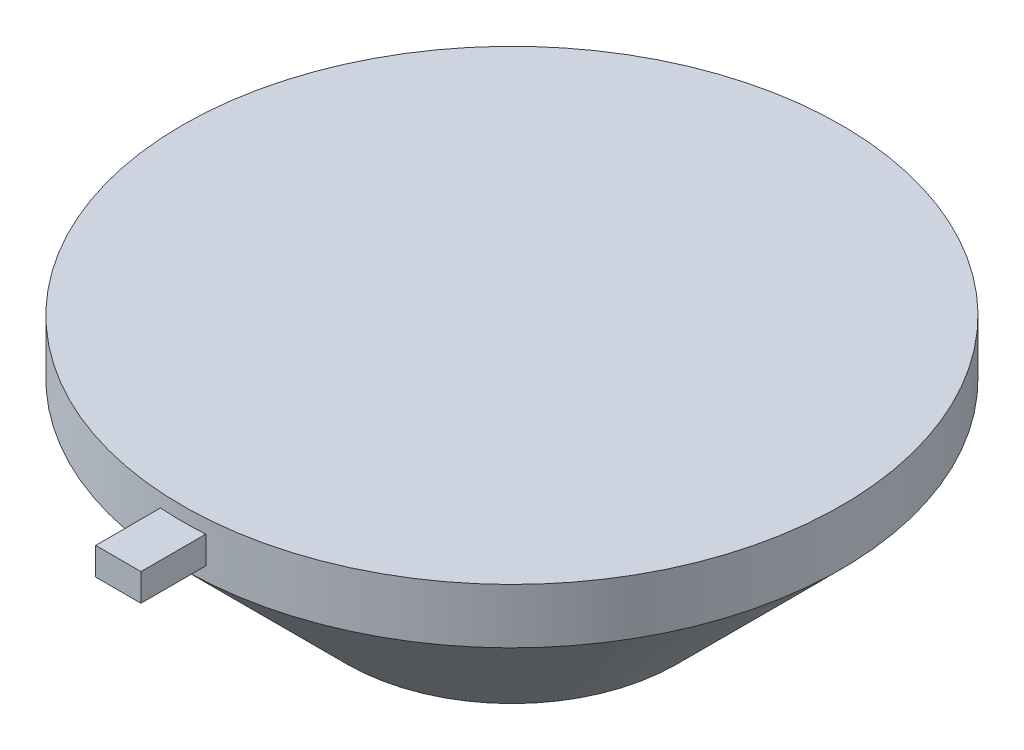
ISO-10303-21;
HEADER;
FILE_DESCRIPTION(('STEP AP214'),'2;1');
FILE_NAME('part.step','',(''),(''),'','','');
FILE_SCHEMA(('AUTOMOTIVE_DESIGN { 1 0 10303 214 1 1 1 1 }'));
ENDSEC;
DATA;
#1=APPLICATION_CONTEXT('core data for automotive mechanical design processes');
#2=APPLICATION_PROTOCOL_DEFINITION('international standard','automotive_design',2000,#1);
#3=PRODUCT_CONTEXT('',#1,'mechanical');
#4=PRODUCT('Part','Part','',(#3));
#5=PRODUCT_RELATED_PRODUCT_CATEGORY('part','',(#4));
#6=PRODUCT_DEFINITION_FORMATION('','',#4);
#7=PRODUCT_DEFINITION_CONTEXT('part definition',#1,'design');
#8=PRODUCT_DEFINITION('design','',#6,#7);
#9=PRODUCT_DEFINITION_SHAPE('','',#8);
#10=(LENGTH_UNIT() NAMED_UNIT(*) SI_UNIT(.MILLI.,.METRE.));
#11=(NAMED_UNIT(*) PLANE_ANGLE_UNIT() SI_UNIT($,.RADIAN.));
#12=(NAMED_UNIT(*) SI_UNIT($,.STERADIAN.) SOLID_ANGLE_UNIT());
#13=UNCERTAINTY_MEASURE_WITH_UNIT(LENGTH_MEASURE(1.E-05),#10,'distance_accuracy_value','');
#14=(GEOMETRIC_REPRESENTATION_CONTEXT(3) GLOBAL_UNCERTAINTY_ASSIGNED_CONTEXT((#13)) GLOBAL_UNIT_ASSIGNED_CONTEXT((#10,
#11,#12)) REPRESENTATION_CONTEXT('',''));
#15=CARTESIAN_POINT('',(0.,0.,0.));
#16=DIRECTION('',(0.,0.,1.));
#17=DIRECTION('',(1.,0.,0.));
#18=AXIS2_PLACEMENT_3D('',#15,#16,#17);
#19=CARTESIAN_POINT('',(6.3211981986109,8.,0.));
#20=DIRECTION('',(0.,-1.,0.));
#21=DIRECTION('',(1.,0.,0.));
#22=AXIS2_PLACEMENT_3D('',#19,#20,#21);
#23=CYLINDRICAL_SURFACE('',#22,12.);
#24=CARTESIAN_POINT('',(6.3211981986109,6.,0.));
#25=DIRECTION('',(0.,1.,0.));
#26=DIRECTION('',(-1.,0.,0.));
#27=AXIS2_PLACEMENT_3D('',#24,#25,#26);
#28=CIRCLE('',#27,12.);
#29=CARTESIAN_POINT('',(-5.6788018013891,6.,0.));
#30=VERTEX_POINT('',#29);
#31=EDGE_CURVE('E128',#30,#30,#28,.T.);
#32=ORIENTED_EDGE('',*,*,#31,.T.);
#33=EDGE_LOOP('',(#32));
#34=FACE_BOUND('',#33,.T.);
#35=CARTESIAN_POINT('',(6.3211981986109,8.,0.));
#36=DIRECTION('',(0.,1.,0.));
#37=DIRECTION('',(-1.,0.,0.));
#38=AXIS2_PLACEMENT_3D('',#35,#36,#37);
#39=CIRCLE('',#38,12.);
#40=CARTESIAN_POINT('',(-5.6788018013891,8.,0.));
#41=VERTEX_POINT('',#40);
#42=EDGE_CURVE('E123',#41,#41,#39,.T.);
#43=ORIENTED_EDGE('',*,*,#42,.F.);
#44=EDGE_LOOP('',(#43));
#45=FACE_BOUND('',#44,.T.);
#46=CARTESIAN_POINT('',(6.3211981986109,6.5,0.));
#47=DIRECTION('',(0.,1.,0.));
#48=DIRECTION('',(-1.,0.,0.));
#49=AXIS2_PLACEMENT_3D('',#46,#47,#48);
#50=CIRCLE('',#49,12.);
#51=CARTESIAN_POINT('',(5.49657350942634,6.5,11.9716328928842));
#52=VERTEX_POINT('',#51);
#53=CARTESIAN_POINT('',(7.14582288779545,6.5,11.9716328928842));
#54=VERTEX_POINT('',#53);
#55=EDGE_CURVE('E12',#52,#54,#50,.T.);
#56=ORIENTED_EDGE('',*,*,#55,.F.);
#57=DIRECTION('',(0.,-1.,0.));
#58=VECTOR('',#57,1.);
#59=CARTESIAN_POINT('',(5.49657350942634,8.,11.9716328928842));
#60=LINE('',#59,#58);
#61=CARTESIAN_POINT('',(5.49657350942634,7.5,11.9716328928842));
#62=VERTEX_POINT('',#61);
#63=EDGE_CURVE('E55',#52,#62,#60,.F.);
#64=ORIENTED_EDGE('',*,*,#63,.T.);
#65=CARTESIAN_POINT('',(6.3211981986109,7.5,0.));
#66=DIRECTION('',(0.,1.,0.));
#67=DIRECTION('',(-1.,0.,0.));
#68=AXIS2_PLACEMENT_3D('',#65,#66,#67);
#69=CIRCLE('',#68,12.);
#70=CARTESIAN_POINT('',(7.14582288779545,7.5,11.9716328928842));
#71=VERTEX_POINT('',#70);
#72=EDGE_CURVE('E136',#62,#71,#69,.T.);
#73=ORIENTED_EDGE('',*,*,#72,.T.);
#74=DIRECTION('',(0.,-1.,0.));
#75=VECTOR('',#74,1.);
#76=CARTESIAN_POINT('',(7.14582288779545,8.,11.9716328928842));
#77=LINE('',#76,#75);
#78=EDGE_CURVE('E140',#71,#54,#77,.T.);
#79=ORIENTED_EDGE('',*,*,#78,.T.);
#80=EDGE_LOOP('',(#56,#64,#73,#79));
#81=FACE_BOUND('',#80,.T.);
#82=ADVANCED_FACE('F46',(#34,#45,#81),#23,.T.);
#83=CARTESIAN_POINT('',(0.,0.,0.));
#84=DIRECTION('',(0.,1.,0.));
#85=DIRECTION('',(0.,0.,1.));
#86=AXIS2_PLACEMENT_3D('',#83,#84,#85);
#87=PLANE('',#86);
#88=CARTESIAN_POINT('',(6.54667647314862,0.,0.));
#89=DIRECTION('',(0.,-1.,0.));
#90=DIRECTION('',(0.,0.,-1.));
#91=AXIS2_PLACEMENT_3D('',#88,#89,#90);
#92=CIRCLE('',#91,1.);
#93=CARTESIAN_POINT('',(6.54667647314862,0.,-1.));
#94=VERTEX_POINT('',#93);
#95=EDGE_CURVE('E226',#94,#94,#92,.T.);
#96=ORIENTED_EDGE('',*,*,#95,.F.);
#97=EDGE_LOOP('',(#96));
#98=FACE_BOUND('',#97,.T.);
#99=CARTESIAN_POINT('',(6.3211981986109,0.,0.));
#100=DIRECTION('',(0.,1.,0.));
#101=DIRECTION('',(0.,0.,1.));
#102=AXIS2_PLACEMENT_3D('',#99,#100,#101);
#103=CIRCLE('',#102,5.99999999999994);
#104=CARTESIAN_POINT('',(6.3211981986109,0.,5.99999999999994));
#105=VERTEX_POINT('',#104);
#106=EDGE_CURVE('E132',#105,#105,#103,.F.);
#107=ORIENTED_EDGE('',*,*,#106,.T.);
#108=EDGE_LOOP('',(#107));
#109=FACE_BOUND('',#108,.T.);
#110=ADVANCED_FACE('F48',(#98,#109),#87,.F.);
#111=CARTESIAN_POINT('',(6.3211981986109,6.,0.));
#112=DIRECTION('',(0.,1.,0.));
#113=DIRECTION('',(-1.,0.,0.));
#114=AXIS2_PLACEMENT_3D('',#111,#112,#113);
#115=CONICAL_SURFACE('',#114,12.,0.785398163397453);
#116=ORIENTED_EDGE('',*,*,#106,.F.);
#117=EDGE_LOOP('',(#116));
#118=FACE_BOUND('',#117,.T.);
#119=ORIENTED_EDGE('',*,*,#31,.F.);
#120=EDGE_LOOP('',(#119));
#121=FACE_BOUND('',#120,.T.);
#122=ADVANCED_FACE('F168',(#118,#121),#115,.T.);
#123=CARTESIAN_POINT('',(6.3211981986109,8.,0.));
#124=DIRECTION('',(0.,1.,0.));
#125=DIRECTION('',(-1.,0.,0.));
#126=AXIS2_PLACEMENT_3D('',#123,#124,#125);
#127=PLANE('',#126);
#128=ORIENTED_EDGE('',*,*,#42,.T.);
#129=EDGE_LOOP('',(#128));
#130=FACE_BOUND('',#129,.T.);
#131=ADVANCED_FACE('F172',(#130),#127,.T.);
#132=CARTESIAN_POINT('',(5.49657350942634,6.5,11.0555609551978));
#133=DIRECTION('',(-1.,0.,0.));
#134=DIRECTION('',(0.,-1.,0.));
#135=AXIS2_PLACEMENT_3D('',#132,#133,#134);
#136=PLANE('',#135);
#137=ORIENTED_EDGE('',*,*,#63,.F.);
#138=DIRECTION('',(0.,0.,1.));
#139=VECTOR('',#138,1.);
#140=CARTESIAN_POINT('',(5.49657350942634,6.5,11.0555609551978));
#141=LINE('',#140,#139);
#142=CARTESIAN_POINT('',(5.49657350942634,6.5,14.332320872553));
#143=VERTEX_POINT('',#142);
#144=EDGE_CURVE('E88',#52,#143,#141,.T.);
#145=ORIENTED_EDGE('',*,*,#144,.T.);
#146=DIRECTION('',(0.,1.,0.));
#147=VECTOR('',#146,1.);
#148=CARTESIAN_POINT('',(5.49657350942634,6.5,14.332320872553));
#149=LINE('',#148,#147);
#150=CARTESIAN_POINT('',(5.49657350942634,7.5,14.332320872553));
#151=VERTEX_POINT('',#150);
#152=EDGE_CURVE('E92',#143,#151,#149,.T.);
#153=ORIENTED_EDGE('',*,*,#152,.T.);
#154=DIRECTION('',(0.,0.,1.));
#155=VECTOR('',#154,1.);
#156=CARTESIAN_POINT('',(5.49657350942634,7.5,11.0555609551978));
#157=LINE('',#156,#155);
#158=EDGE_CURVE('E114',#62,#151,#157,.T.);
#159=ORIENTED_EDGE('',*,*,#158,.F.);
#160=EDGE_LOOP('',(#137,#145,#153,#159));
#161=FACE_BOUND('',#160,.T.);
#162=ADVANCED_FACE('F90',(#161),#136,.T.);
#163=CARTESIAN_POINT('',(7.14582288779545,6.5,11.0555609551978));
#164=DIRECTION('',(1.,0.,0.));
#165=DIRECTION('',(0.,1.,0.));
#166=AXIS2_PLACEMENT_3D('',#163,#164,#165);
#167=PLANE('',#166);
#168=ORIENTED_EDGE('',*,*,#78,.F.);
#169=DIRECTION('',(0.,0.,-1.));
#170=VECTOR('',#169,1.);
#171=CARTESIAN_POINT('',(7.14582288779545,7.5,11.0555609551978));
#172=LINE('',#171,#170);
#173=CARTESIAN_POINT('',(7.14582288779545,7.5,14.332320872553));
#174=VERTEX_POINT('',#173);
#175=EDGE_CURVE('E62',#174,#71,#172,.T.);
#176=ORIENTED_EDGE('',*,*,#175,.F.);
#177=DIRECTION('',(0.,1.,0.));
#178=VECTOR('',#177,1.);
#179=CARTESIAN_POINT('',(7.14582288779545,6.5,14.332320872553));
#180=LINE('',#179,#178);
#181=CARTESIAN_POINT('',(7.14582288779545,6.5,14.332320872553));
#182=VERTEX_POINT('',#181);
#183=EDGE_CURVE('E104',#182,#174,#180,.T.);
#184=ORIENTED_EDGE('',*,*,#183,.F.);
#185=DIRECTION('',(0.,0.,-1.));
#186=VECTOR('',#185,1.);
#187=CARTESIAN_POINT('',(7.14582288779545,6.5,11.0555609551978));
#188=LINE('',#187,#186);
#189=EDGE_CURVE('E105',#182,#54,#188,.T.);
#190=ORIENTED_EDGE('',*,*,#189,.T.);
#191=EDGE_LOOP('',(#168,#176,#184,#190));
#192=FACE_BOUND('',#191,.T.);
#193=ADVANCED_FACE('F146',(#192),#167,.T.);
#194=CARTESIAN_POINT('',(5.49657350942634,6.5,14.332320872553));
#195=DIRECTION('',(0.,0.,1.));
#196=DIRECTION('',(1.,0.,0.));
#197=AXIS2_PLACEMENT_3D('',#194,#195,#196);
#198=PLANE('',#197);
#199=DIRECTION('',(1.,0.,0.));
#200=VECTOR('',#199,1.);
#201=CARTESIAN_POINT('',(5.49657350942634,7.5,14.332320872553));
#202=LINE('',#201,#200);
#203=EDGE_CURVE('E102',#151,#174,#202,.T.);
#204=ORIENTED_EDGE('',*,*,#203,.F.);
#205=ORIENTED_EDGE('',*,*,#152,.F.);
#206=DIRECTION('',(1.,0.,0.));
#207=VECTOR('',#206,1.);
#208=CARTESIAN_POINT('',(5.49657350942634,6.5,14.332320872553));
#209=LINE('',#208,#207);
#210=EDGE_CURVE('E97',#143,#182,#209,.T.);
#211=ORIENTED_EDGE('',*,*,#210,.T.);
#212=ORIENTED_EDGE('',*,*,#183,.T.);
#213=EDGE_LOOP('',(#204,#205,#211,#212));
#214=FACE_BOUND('',#213,.T.);
#215=ADVANCED_FACE('F101',(#214),#198,.T.);
#216=CARTESIAN_POINT('',(0.,6.49999999999999,0.));
#217=DIRECTION('',(0.,1.,0.));
#218=DIRECTION('',(-1.,0.,0.));
#219=AXIS2_PLACEMENT_3D('',#216,#217,#218);
#220=PLANE('',#219);
#221=ORIENTED_EDGE('',*,*,#144,.F.);
#222=ORIENTED_EDGE('',*,*,#55,.T.);
#223=ORIENTED_EDGE('',*,*,#189,.F.);
#224=ORIENTED_EDGE('',*,*,#210,.F.);
#225=EDGE_LOOP('',(#221,#222,#223,#224));
#226=FACE_BOUND('',#225,.T.);
#227=ADVANCED_FACE('F107',(#226),#220,.F.);
#228=CARTESIAN_POINT('',(0.,7.49999999999999,0.));
#229=DIRECTION('',(0.,1.,0.));
#230=DIRECTION('',(-1.,0.,0.));
#231=AXIS2_PLACEMENT_3D('',#228,#229,#230);
#232=PLANE('',#231);
#233=ORIENTED_EDGE('',*,*,#72,.F.);
#234=ORIENTED_EDGE('',*,*,#158,.T.);
#235=ORIENTED_EDGE('',*,*,#203,.T.);
#236=ORIENTED_EDGE('',*,*,#175,.T.);
#237=EDGE_LOOP('',(#233,#234,#235,#236));
#238=FACE_BOUND('',#237,.T.);
#239=ADVANCED_FACE('F147',(#238),#232,.T.);
#240=CARTESIAN_POINT('',(6.54667647314862,2.,0.));
#241=DIRECTION('',(0.,-1.,0.));
#242=DIRECTION('',(0.,0.,-1.));
#243=AXIS2_PLACEMENT_3D('',#240,#241,#242);
#244=CYLINDRICAL_SURFACE('',#243,1.);
#245=CARTESIAN_POINT('',(6.54667647314862,2.,0.));
#246=DIRECTION('',(0.,-1.,0.));
#247=DIRECTION('',(0.,0.,-1.));
#248=AXIS2_PLACEMENT_3D('',#245,#246,#247);
#249=CIRCLE('',#248,1.);
#250=CARTESIAN_POINT('',(6.54667647314862,2.,-1.));
#251=VERTEX_POINT('',#250);
#252=EDGE_CURVE('E117',#251,#251,#249,.T.);
#253=ORIENTED_EDGE('',*,*,#252,.F.);
#254=EDGE_LOOP('',(#253));
#255=FACE_BOUND('',#254,.T.);
#256=ORIENTED_EDGE('',*,*,#95,.T.);
#257=EDGE_LOOP('',(#256));
#258=FACE_BOUND('',#257,.T.);
#259=ADVANCED_FACE('F149',(#255,#258),#244,.F.);
#260=CARTESIAN_POINT('',(6.54667647314862,2.,0.));
#261=DIRECTION('',(0.,-1.,0.));
#262=DIRECTION('',(0.,0.,-1.));
#263=AXIS2_PLACEMENT_3D('',#260,#261,#262);
#264=PLANE('',#263);
#265=ORIENTED_EDGE('',*,*,#252,.T.);
#266=EDGE_LOOP('',(#265));
#267=FACE_BOUND('',#266,.T.);
#268=ADVANCED_FACE('F156',(#267),#264,.T.);
#269=CLOSED_SHELL('',(#82,#110,#122,#131,#162,#193,#215,#227,#239,#259,#268));
#270=MANIFOLD_SOLID_BREP('B2',#269);
#271=ADVANCED_BREP_SHAPE_REPRESENTATION('',(#18,#270),#14);
#272=SHAPE_DEFINITION_REPRESENTATION(#9,#271);
ENDSEC;
END-ISO-10303-21;
